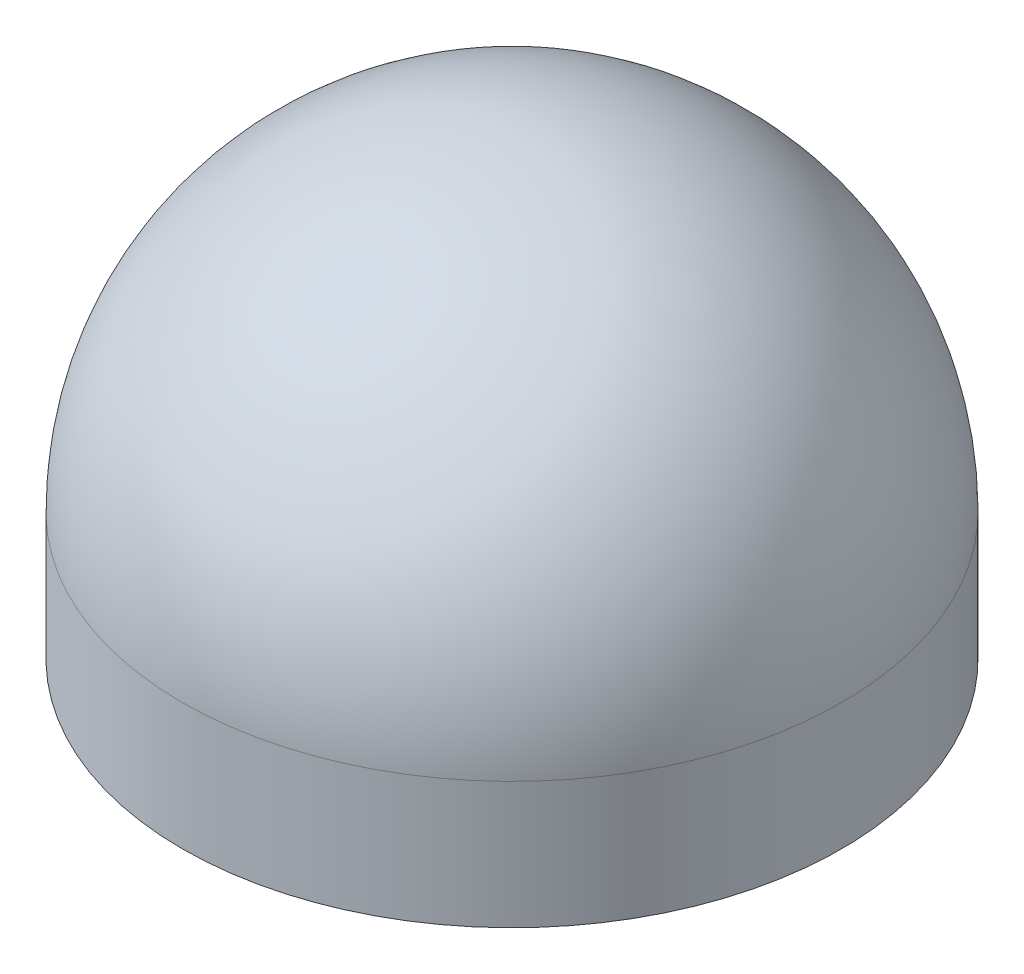
ISO-10303-21;
HEADER;
FILE_DESCRIPTION(('STEP AP214'),'2;1');
FILE_NAME('part.step','',(''),(''),'','','');
FILE_SCHEMA(('AUTOMOTIVE_DESIGN { 1 0 10303 214 1 1 1 1 }'));
ENDSEC;
DATA;
#1=APPLICATION_CONTEXT('core data for automotive mechanical design processes');
#2=APPLICATION_PROTOCOL_DEFINITION('international standard','automotive_design',2000,#1);
#3=PRODUCT_CONTEXT('',#1,'mechanical');
#4=PRODUCT('Part','Part','',(#3));
#5=PRODUCT_RELATED_PRODUCT_CATEGORY('part','',(#4));
#6=PRODUCT_DEFINITION_FORMATION('','',#4);
#7=PRODUCT_DEFINITION_CONTEXT('part definition',#1,'design');
#8=PRODUCT_DEFINITION('design','',#6,#7);
#9=PRODUCT_DEFINITION_SHAPE('','',#8);
#10=(LENGTH_UNIT() NAMED_UNIT(*) SI_UNIT(.MILLI.,.METRE.));
#11=(NAMED_UNIT(*) PLANE_ANGLE_UNIT() SI_UNIT($,.RADIAN.));
#12=(NAMED_UNIT(*) SI_UNIT($,.STERADIAN.) SOLID_ANGLE_UNIT());
#13=UNCERTAINTY_MEASURE_WITH_UNIT(LENGTH_MEASURE(1.E-05),#10,'distance_accuracy_value','');
#14=(GEOMETRIC_REPRESENTATION_CONTEXT(3) GLOBAL_UNCERTAINTY_ASSIGNED_CONTEXT((#13)) GLOBAL_UNIT_ASSIGNED_CONTEXT((#10,
#11,#12)) REPRESENTATION_CONTEXT('',''));
#15=CARTESIAN_POINT('',(0.,0.,0.));
#16=DIRECTION('',(0.,0.,1.));
#17=DIRECTION('',(1.,0.,0.));
#18=AXIS2_PLACEMENT_3D('',#15,#16,#17);
#19=CARTESIAN_POINT('',(0.,1.25,0.));
#20=DIRECTION('',(0.,1.,0.));
#21=DIRECTION('',(0.,0.,1.));
#22=AXIS2_PLACEMENT_3D('',#19,#20,#21);
#23=SPHERICAL_SURFACE('',#22,2.8);
#24=CARTESIAN_POINT('',(0.,1.25,0.));
#25=DIRECTION('',(0.,-1.,0.));
#26=DIRECTION('',(0.,0.,-1.));
#27=AXIS2_PLACEMENT_3D('',#24,#25,#26);
#28=CIRCLE('',#27,2.8);
#29=CARTESIAN_POINT('',(0.,1.25,-2.8));
#30=VERTEX_POINT('',#29);
#31=EDGE_CURVE('E48',#30,#30,#28,.T.);
#32=ORIENTED_EDGE('',*,*,#31,.T.);
#33=EDGE_LOOP('',(#32));
#34=FACE_BOUND('',#33,.T.);
#35=CARTESIAN_POINT('',(0.,3.5,0.));
#36=DIRECTION('',(0.,1.,0.));
#37=DIRECTION('',(0.,0.,1.));
#38=AXIS2_PLACEMENT_3D('',#35,#36,#37);
#39=CIRCLE('',#38,1.6665833312499);
#40=CARTESIAN_POINT('',(0.,3.5,1.6665833312499));
#41=VERTEX_POINT('',#40);
#42=EDGE_CURVE('E11',#41,#41,#39,.F.);
#43=ORIENTED_EDGE('',*,*,#42,.F.);
#44=EDGE_LOOP('',(#43));
#45=FACE_BOUND('',#44,.T.);
#46=ADVANCED_FACE('F33',(#34,#45),#23,.F.);
#47=CARTESIAN_POINT('',(0.,4.5,0.));
#48=DIRECTION('',(0.,-1.,0.));
#49=DIRECTION('',(0.,0.,-1.));
#50=AXIS2_PLACEMENT_3D('',#47,#48,#49);
#51=CYLINDRICAL_SURFACE('',#50,3.25);
#52=CARTESIAN_POINT('',(0.,1.25,0.));
#53=DIRECTION('',(0.,-1.,0.));
#54=DIRECTION('',(0.,0.,-1.));
#55=AXIS2_PLACEMENT_3D('',#52,#53,#54);
#56=CIRCLE('',#55,3.25);
#57=CARTESIAN_POINT('',(0.,1.25,-3.25));
#58=VERTEX_POINT('',#57);
#59=EDGE_CURVE('E40',#58,#58,#56,.T.);
#60=ORIENTED_EDGE('',*,*,#59,.T.);
#61=EDGE_LOOP('',(#60));
#62=FACE_BOUND('',#61,.T.);
#63=CARTESIAN_POINT('',(0.,0.,0.));
#64=DIRECTION('',(0.,1.,0.));
#65=DIRECTION('',(0.,0.,1.));
#66=AXIS2_PLACEMENT_3D('',#63,#64,#65);
#67=CIRCLE('',#66,3.25);
#68=CARTESIAN_POINT('',(0.,0.,3.25));
#69=VERTEX_POINT('',#68);
#70=EDGE_CURVE('E44',#69,#69,#67,.T.);
#71=ORIENTED_EDGE('',*,*,#70,.T.);
#72=EDGE_LOOP('',(#71));
#73=FACE_BOUND('',#72,.T.);
#74=ADVANCED_FACE('F69',(#62,#73),#51,.T.);
#75=CARTESIAN_POINT('',(0.,0.,0.));
#76=DIRECTION('',(0.,1.,0.));
#77=DIRECTION('',(0.,0.,1.));
#78=AXIS2_PLACEMENT_3D('',#75,#76,#77);
#79=PLANE('',#78);
#80=CARTESIAN_POINT('',(0.,0.,0.));
#81=DIRECTION('',(0.,1.,0.));
#82=DIRECTION('',(0.,0.,1.));
#83=AXIS2_PLACEMENT_3D('',#80,#81,#82);
#84=CIRCLE('',#83,2.8);
#85=CARTESIAN_POINT('',(0.,0.,2.8));
#86=VERTEX_POINT('',#85);
#87=EDGE_CURVE('E51',#86,#86,#84,.T.);
#88=ORIENTED_EDGE('',*,*,#87,.T.);
#89=EDGE_LOOP('',(#88));
#90=FACE_BOUND('',#89,.T.);
#91=ORIENTED_EDGE('',*,*,#70,.F.);
#92=EDGE_LOOP('',(#91));
#93=FACE_BOUND('',#92,.T.);
#94=ADVANCED_FACE('F66',(#90,#93),#79,.F.);
#95=CARTESIAN_POINT('',(0.,1.25,0.));
#96=DIRECTION('',(0.,1.,0.));
#97=DIRECTION('',(0.,0.,1.));
#98=AXIS2_PLACEMENT_3D('',#95,#96,#97);
#99=SPHERICAL_SURFACE('',#98,3.25);
#100=ORIENTED_EDGE('',*,*,#59,.F.);
#101=EDGE_LOOP('',(#100));
#102=FACE_BOUND('',#101,.T.);
#103=ADVANCED_FACE('F35',(#102),#99,.T.);
#104=CARTESIAN_POINT('',(0.,4.5,0.));
#105=DIRECTION('',(0.,-1.,0.));
#106=DIRECTION('',(0.,0.,-1.));
#107=AXIS2_PLACEMENT_3D('',#104,#105,#106);
#108=CYLINDRICAL_SURFACE('',#107,2.8);
#109=ORIENTED_EDGE('',*,*,#31,.F.);
#110=EDGE_LOOP('',(#109));
#111=FACE_BOUND('',#110,.T.);
#112=ORIENTED_EDGE('',*,*,#87,.F.);
#113=EDGE_LOOP('',(#112));
#114=FACE_BOUND('',#113,.T.);
#115=ADVANCED_FACE('F59',(#111,#114),#108,.F.);
#116=CARTESIAN_POINT('',(0.,3.5,0.));
#117=DIRECTION('',(0.,1.,0.));
#118=DIRECTION('',(0.,0.,1.));
#119=AXIS2_PLACEMENT_3D('',#116,#117,#118);
#120=PLANE('',#119);
#121=ORIENTED_EDGE('',*,*,#42,.T.);
#122=EDGE_LOOP('',(#121));
#123=FACE_BOUND('',#122,.T.);
#124=ADVANCED_FACE('F62',(#123),#120,.F.);
#125=CLOSED_SHELL('',(#46,#74,#94,#103,#115,#124));
#126=MANIFOLD_SOLID_BREP('B2',#125);
#127=ADVANCED_BREP_SHAPE_REPRESENTATION('',(#18,#126),#14);
#128=SHAPE_DEFINITION_REPRESENTATION(#9,#127);
ENDSEC;
END-ISO-10303-21;
